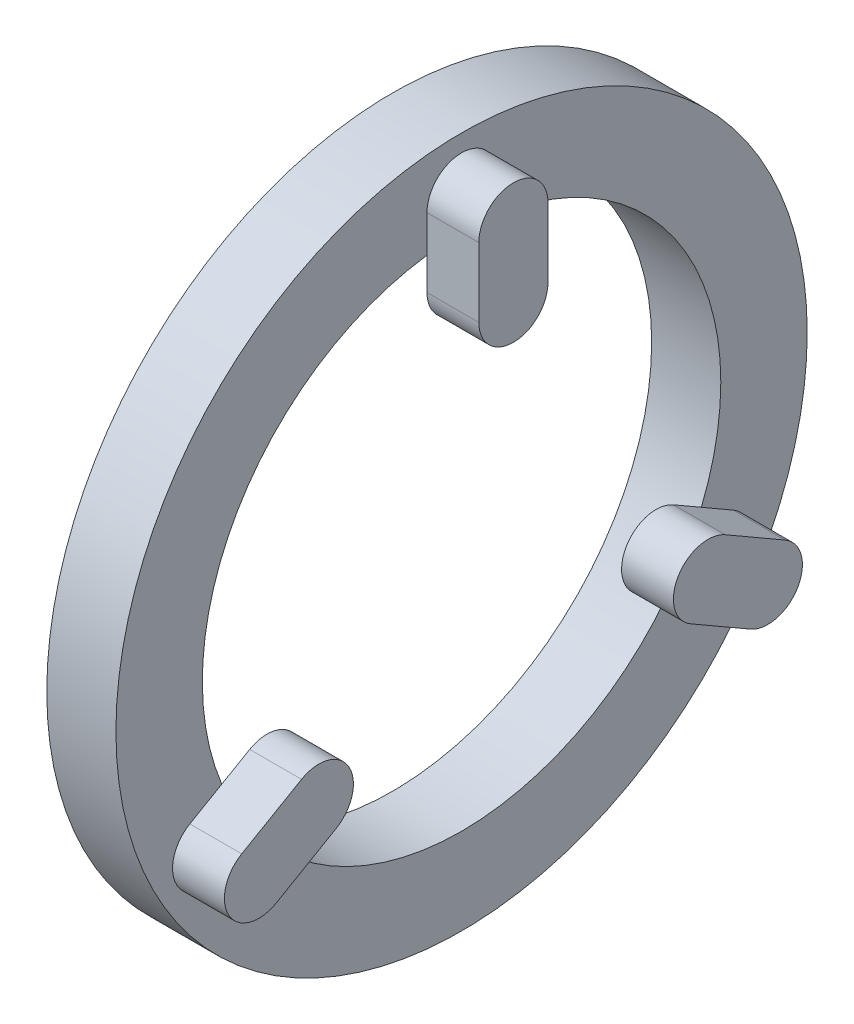
ISO-10303-21;
HEADER;
FILE_DESCRIPTION(('STEP AP214'),'2;1');
FILE_NAME('part.step','',(''),(''),'','','');
FILE_SCHEMA(('AUTOMOTIVE_DESIGN { 1 0 10303 214 1 1 1 1 }'));
ENDSEC;
DATA;
#1=APPLICATION_CONTEXT('core data for automotive mechanical design processes');
#2=APPLICATION_PROTOCOL_DEFINITION('international standard','automotive_design',2000,#1);
#3=PRODUCT_CONTEXT('',#1,'mechanical');
#4=PRODUCT('Part','Part','',(#3));
#5=PRODUCT_RELATED_PRODUCT_CATEGORY('part','',(#4));
#6=PRODUCT_DEFINITION_FORMATION('','',#4);
#7=PRODUCT_DEFINITION_CONTEXT('part definition',#1,'design');
#8=PRODUCT_DEFINITION('design','',#6,#7);
#9=PRODUCT_DEFINITION_SHAPE('','',#8);
#10=(LENGTH_UNIT() NAMED_UNIT(*) SI_UNIT(.MILLI.,.METRE.));
#11=(NAMED_UNIT(*) PLANE_ANGLE_UNIT() SI_UNIT($,.RADIAN.));
#12=(NAMED_UNIT(*) SI_UNIT($,.STERADIAN.) SOLID_ANGLE_UNIT());
#13=UNCERTAINTY_MEASURE_WITH_UNIT(LENGTH_MEASURE(1.E-05),#10,'distance_accuracy_value','');
#14=(GEOMETRIC_REPRESENTATION_CONTEXT(3) GLOBAL_UNCERTAINTY_ASSIGNED_CONTEXT((#13)) GLOBAL_UNIT_ASSIGNED_CONTEXT((#10,
#11,#12)) REPRESENTATION_CONTEXT('',''));
#15=CARTESIAN_POINT('',(0.,0.,0.));
#16=DIRECTION('',(0.,0.,1.));
#17=DIRECTION('',(1.,0.,0.));
#18=AXIS2_PLACEMENT_3D('',#15,#16,#17);
#19=CARTESIAN_POINT('',(2.,0.,0.));
#20=DIRECTION('',(1.,0.,0.));
#21=DIRECTION('',(0.,0.,-1.));
#22=AXIS2_PLACEMENT_3D('',#19,#20,#21);
#23=PLANE('',#22);
#24=DIRECTION('',(0.,0.5,-0.866025403784439));
#25=VECTOR('',#24,1.);
#26=CARTESIAN_POINT('',(2.,-3.38397459621559,7.86121593216771));
#27=LINE('',#26,#25);
#28=CARTESIAN_POINT('',(2.,-3.3839745962156,7.86121593216771));
#29=VERTEX_POINT('',#28);
#30=CARTESIAN_POINT('',(2.,-2.85049178304522,6.93719659479185));
#31=VERTEX_POINT('',#30);
#32=EDGE_CURVE('E314',#29,#31,#27,.T.);
#33=ORIENTED_EDGE('',*,*,#32,.T.);
#34=CARTESIAN_POINT('',(2.,0.,0.));
#35=DIRECTION('',(1.,0.,0.));
#36=DIRECTION('',(0.,0.,-1.));
#37=AXIS2_PLACEMENT_3D('',#34,#35,#36);
#38=CIRCLE('',#37,7.5);
#39=CARTESIAN_POINT('',(2.,7.43303437365925,1.));
#40=VERTEX_POINT('',#39);
#41=EDGE_CURVE('E362',#40,#31,#38,.T.);
#42=ORIENTED_EDGE('',*,*,#41,.F.);
#43=DIRECTION('',(0.,-1.,0.));
#44=VECTOR('',#43,1.);
#45=CARTESIAN_POINT('',(2.,8.5,1.));
#46=LINE('',#45,#44);
#47=CARTESIAN_POINT('',(2.,8.5,1.));
#48=VERTEX_POINT('',#47);
#49=EDGE_CURVE('E355',#48,#40,#46,.T.);
#50=ORIENTED_EDGE('',*,*,#49,.F.);
#51=CARTESIAN_POINT('',(2.,8.5,0.));
#52=DIRECTION('',(1.,0.,0.));
#53=DIRECTION('',(0.,0.,-1.));
#54=AXIS2_PLACEMENT_3D('',#51,#52,#53);
#55=CIRCLE('',#54,1.);
#56=CARTESIAN_POINT('',(2.,8.5,-1.));
#57=VERTEX_POINT('',#56);
#58=EDGE_CURVE('E330',#57,#48,#55,.T.);
#59=ORIENTED_EDGE('',*,*,#58,.F.);
#60=DIRECTION('',(0.,1.,0.));
#61=VECTOR('',#60,1.);
#62=CARTESIAN_POINT('',(2.,6.5,-0.999999999999999));
#63=LINE('',#62,#61);
#64=CARTESIAN_POINT('',(2.,7.43303437365925,-1.));
#65=VERTEX_POINT('',#64);
#66=EDGE_CURVE('E12',#65,#57,#63,.T.);
#67=ORIENTED_EDGE('',*,*,#66,.F.);
#68=CARTESIAN_POINT('',(2.,-2.85049178304517,-6.93719659479188));
#69=VERTEX_POINT('',#68);
#70=EDGE_CURVE('E339',#69,#65,#38,.T.);
#71=ORIENTED_EDGE('',*,*,#70,.F.);
#72=DIRECTION('',(0.,-0.499999999999995,-0.866025403784442));
#73=VECTOR('',#72,1.);
#74=CARTESIAN_POINT('',(2.,-2.38397459621555,-6.12916512459885));
#75=LINE('',#74,#73);
#76=CARTESIAN_POINT('',(2.,-3.38397459621554,-7.86121593216774));
#77=VERTEX_POINT('',#76);
#78=EDGE_CURVE('E318',#69,#77,#75,.T.);
#79=ORIENTED_EDGE('',*,*,#78,.T.);
#80=CARTESIAN_POINT('',(2.,-4.24999999999998,-7.36121593216774));
#81=DIRECTION('',(1.,0.,0.));
#82=DIRECTION('',(0.,0.,-1.));
#83=AXIS2_PLACEMENT_3D('',#80,#81,#82);
#84=CIRCLE('',#83,1.);
#85=CARTESIAN_POINT('',(2.,-5.11602540378442,-6.86121593216774));
#86=VERTEX_POINT('',#85);
#87=EDGE_CURVE('E298',#86,#77,#84,.T.);
#88=ORIENTED_EDGE('',*,*,#87,.F.);
#89=DIRECTION('',(0.,0.500000000000002,0.866025403784437));
#90=VECTOR('',#89,1.);
#91=CARTESIAN_POINT('',(2.,-5.11602540378442,-6.86121593216774));
#92=LINE('',#91,#90);
#93=CARTESIAN_POINT('',(2.,-4.58254259061405,-5.93719659479188));
#94=VERTEX_POINT('',#93);
#95=EDGE_CURVE('E315',#86,#94,#92,.T.);
#96=ORIENTED_EDGE('',*,*,#95,.T.);
#97=CARTESIAN_POINT('',(2.,-4.5825425906141,5.93719659479184));
#98=VERTEX_POINT('',#97);
#99=EDGE_CURVE('E363',#98,#94,#38,.T.);
#100=ORIENTED_EDGE('',*,*,#99,.F.);
#101=DIRECTION('',(0.,-0.500000000000005,0.866025403784436));
#102=VECTOR('',#101,1.);
#103=CARTESIAN_POINT('',(2.,-4.11602540378447,5.12916512459884));
#104=LINE('',#103,#102);
#105=CARTESIAN_POINT('',(2.,-5.11602540378447,6.8612159321677));
#106=VERTEX_POINT('',#105);
#107=EDGE_CURVE('E643',#98,#106,#104,.T.);
#108=ORIENTED_EDGE('',*,*,#107,.T.);
#109=CARTESIAN_POINT('',(2.,-4.25000000000004,7.36121593216771));
#110=DIRECTION('',(1.,0.,0.));
#111=DIRECTION('',(0.,0.,-1.));
#112=AXIS2_PLACEMENT_3D('',#109,#110,#111);
#113=CIRCLE('',#112,1.);
#114=EDGE_CURVE('E265',#29,#106,#113,.T.);
#115=ORIENTED_EDGE('',*,*,#114,.F.);
#116=EDGE_LOOP('',(#33,#42,#50,#59,#67,#71,#79,#88,#96,#100,#108,#115));
#117=FACE_BOUND('',#116,.T.);
#118=CARTESIAN_POINT('',(2.,0.,0.));
#119=DIRECTION('',(1.,0.,0.));
#120=DIRECTION('',(0.,0.,-1.));
#121=AXIS2_PLACEMENT_3D('',#118,#119,#120);
#122=CIRCLE('',#121,10.);
#123=CARTESIAN_POINT('',(2.,0.,-10.));
#124=VERTEX_POINT('',#123);
#125=EDGE_CURVE('E153',#124,#124,#122,.T.);
#126=ORIENTED_EDGE('',*,*,#125,.T.);
#127=EDGE_LOOP('',(#126));
#128=FACE_BOUND('',#127,.T.);
#129=ADVANCED_FACE('F144',(#117,#128),#23,.T.);
#130=CARTESIAN_POINT('',(2.,0.,0.));
#131=DIRECTION('',(-1.,0.,0.));
#132=DIRECTION('',(0.,0.,1.));
#133=AXIS2_PLACEMENT_3D('',#130,#131,#132);
#134=CYLINDRICAL_SURFACE('',#133,10.);
#135=ORIENTED_EDGE('',*,*,#125,.F.);
#136=EDGE_LOOP('',(#135));
#137=FACE_BOUND('',#136,.T.);
#138=CARTESIAN_POINT('',(0.,0.,0.));
#139=DIRECTION('',(1.,0.,0.));
#140=DIRECTION('',(0.,0.,-1.));
#141=AXIS2_PLACEMENT_3D('',#138,#139,#140);
#142=CIRCLE('',#141,10.);
#143=CARTESIAN_POINT('',(0.,0.,-10.));
#144=VERTEX_POINT('',#143);
#145=EDGE_CURVE('E365',#144,#144,#142,.T.);
#146=ORIENTED_EDGE('',*,*,#145,.T.);
#147=EDGE_LOOP('',(#146));
#148=FACE_BOUND('',#147,.T.);
#149=ADVANCED_FACE('F146',(#137,#148),#134,.T.);
#150=CARTESIAN_POINT('',(0.,0.,0.));
#151=DIRECTION('',(1.,0.,0.));
#152=DIRECTION('',(0.,0.,-1.));
#153=AXIS2_PLACEMENT_3D('',#150,#151,#152);
#154=PLANE('',#153);
#155=CARTESIAN_POINT('',(0.,0.,0.));
#156=DIRECTION('',(1.,0.,0.));
#157=DIRECTION('',(0.,0.,-1.));
#158=AXIS2_PLACEMENT_3D('',#155,#156,#157);
#159=CIRCLE('',#158,7.5);
#160=CARTESIAN_POINT('',(0.,0.,-7.5));
#161=VERTEX_POINT('',#160);
#162=EDGE_CURVE('E148',#161,#161,#159,.T.);
#163=ORIENTED_EDGE('',*,*,#162,.T.);
#164=EDGE_LOOP('',(#163));
#165=FACE_BOUND('',#164,.T.);
#166=ORIENTED_EDGE('',*,*,#145,.F.);
#167=EDGE_LOOP('',(#166));
#168=FACE_BOUND('',#167,.T.);
#169=ADVANCED_FACE('F372',(#165,#168),#154,.F.);
#170=CARTESIAN_POINT('',(-10.5,0.,0.));
#171=DIRECTION('',(1.,0.,0.));
#172=DIRECTION('',(0.,0.,-1.));
#173=AXIS2_PLACEMENT_3D('',#170,#171,#172);
#174=CYLINDRICAL_SURFACE('',#173,7.5);
#175=EDGE_CURVE('E359',#65,#40,#38,.T.);
#176=ORIENTED_EDGE('',*,*,#175,.T.);
#177=ORIENTED_EDGE('',*,*,#41,.T.);
#178=EDGE_CURVE('E412',#31,#98,#38,.T.);
#179=ORIENTED_EDGE('',*,*,#178,.T.);
#180=ORIENTED_EDGE('',*,*,#99,.T.);
#181=EDGE_CURVE('E415',#94,#69,#38,.T.);
#182=ORIENTED_EDGE('',*,*,#181,.T.);
#183=ORIENTED_EDGE('',*,*,#70,.T.);
#184=EDGE_LOOP('',(#176,#177,#179,#180,#182,#183));
#185=FACE_BOUND('',#184,.T.);
#186=ORIENTED_EDGE('',*,*,#162,.F.);
#187=EDGE_LOOP('',(#186));
#188=FACE_BOUND('',#187,.T.);
#189=ADVANCED_FACE('F375',(#185,#188),#174,.F.);
#190=CARTESIAN_POINT('',(2.,8.5,0.));
#191=DIRECTION('',(1.,0.,0.));
#192=DIRECTION('',(0.,0.,-1.));
#193=AXIS2_PLACEMENT_3D('',#190,#191,#192);
#194=PLANE('',#193);
#195=ORIENTED_EDGE('',*,*,#175,.F.);
#196=CARTESIAN_POINT('',(2.,6.5,-0.999999999999999));
#197=VERTEX_POINT('',#196);
#198=EDGE_CURVE('E155',#197,#65,#63,.T.);
#199=ORIENTED_EDGE('',*,*,#198,.F.);
#200=CARTESIAN_POINT('',(2.,6.5,0.));
#201=DIRECTION('',(1.,0.,0.));
#202=DIRECTION('',(0.,0.,-1.));
#203=AXIS2_PLACEMENT_3D('',#200,#201,#202);
#204=CIRCLE('',#203,0.999999999999999);
#205=CARTESIAN_POINT('',(2.,6.5,0.999999999999999));
#206=VERTEX_POINT('',#205);
#207=EDGE_CURVE('E344',#206,#197,#204,.T.);
#208=ORIENTED_EDGE('',*,*,#207,.F.);
#209=EDGE_CURVE('E294',#40,#206,#46,.T.);
#210=ORIENTED_EDGE('',*,*,#209,.F.);
#211=EDGE_LOOP('',(#195,#199,#208,#210));
#212=FACE_BOUND('',#211,.T.);
#213=ADVANCED_FACE('F377',(#212),#194,.F.);
#214=CARTESIAN_POINT('',(3.5,8.5,0.));
#215=DIRECTION('',(1.,0.,0.));
#216=DIRECTION('',(0.,0.,-1.));
#217=AXIS2_PLACEMENT_3D('',#214,#215,#216);
#218=PLANE('',#217);
#219=DIRECTION('',(0.,-1.,0.));
#220=VECTOR('',#219,1.);
#221=CARTESIAN_POINT('',(3.5,8.5,1.));
#222=LINE('',#221,#220);
#223=CARTESIAN_POINT('',(3.5,8.5,1.));
#224=VERTEX_POINT('',#223);
#225=CARTESIAN_POINT('',(3.5,6.5,0.999999999999999));
#226=VERTEX_POINT('',#225);
#227=EDGE_CURVE('E350',#224,#226,#222,.T.);
#228=ORIENTED_EDGE('',*,*,#227,.T.);
#229=CARTESIAN_POINT('',(3.5,6.5,0.));
#230=DIRECTION('',(1.,0.,0.));
#231=DIRECTION('',(0.,0.,-1.));
#232=AXIS2_PLACEMENT_3D('',#229,#230,#231);
#233=CIRCLE('',#232,0.999999999999999);
#234=CARTESIAN_POINT('',(3.5,6.5,-0.999999999999999));
#235=VERTEX_POINT('',#234);
#236=EDGE_CURVE('E340',#226,#235,#233,.T.);
#237=ORIENTED_EDGE('',*,*,#236,.T.);
#238=DIRECTION('',(0.,1.,0.));
#239=VECTOR('',#238,1.);
#240=CARTESIAN_POINT('',(3.5,6.5,-0.999999999999999));
#241=LINE('',#240,#239);
#242=CARTESIAN_POINT('',(3.5,8.5,-1.));
#243=VERTEX_POINT('',#242);
#244=EDGE_CURVE('E347',#235,#243,#241,.T.);
#245=ORIENTED_EDGE('',*,*,#244,.T.);
#246=CARTESIAN_POINT('',(3.5,8.5,0.));
#247=DIRECTION('',(1.,0.,0.));
#248=DIRECTION('',(0.,0.,-1.));
#249=AXIS2_PLACEMENT_3D('',#246,#247,#248);
#250=CIRCLE('',#249,1.);
#251=EDGE_CURVE('E326',#243,#224,#250,.T.);
#252=ORIENTED_EDGE('',*,*,#251,.T.);
#253=EDGE_LOOP('',(#228,#237,#245,#252));
#254=FACE_BOUND('',#253,.T.);
#255=ADVANCED_FACE('F385',(#254),#218,.T.);
#256=CARTESIAN_POINT('',(3.5,8.5,0.));
#257=DIRECTION('',(-1.,0.,0.));
#258=DIRECTION('',(0.,0.,1.));
#259=AXIS2_PLACEMENT_3D('',#256,#257,#258);
#260=CYLINDRICAL_SURFACE('',#259,1.);
#261=DIRECTION('',(-1.,0.,0.));
#262=VECTOR('',#261,1.);
#263=CARTESIAN_POINT('',(3.5,8.5,1.));
#264=LINE('',#263,#262);
#265=EDGE_CURVE('E336',#224,#48,#264,.T.);
#266=ORIENTED_EDGE('',*,*,#265,.F.);
#267=ORIENTED_EDGE('',*,*,#251,.F.);
#268=DIRECTION('',(-1.,0.,0.));
#269=VECTOR('',#268,1.);
#270=CARTESIAN_POINT('',(3.5,8.5,-1.));
#271=LINE('',#270,#269);
#272=EDGE_CURVE('E329',#243,#57,#271,.T.);
#273=ORIENTED_EDGE('',*,*,#272,.T.);
#274=ORIENTED_EDGE('',*,*,#58,.T.);
#275=EDGE_LOOP('',(#266,#267,#273,#274));
#276=FACE_BOUND('',#275,.T.);
#277=ADVANCED_FACE('F380',(#276),#260,.T.);
#278=CARTESIAN_POINT('',(3.5,6.5,0.));
#279=DIRECTION('',(-1.,0.,0.));
#280=DIRECTION('',(0.,0.,1.));
#281=AXIS2_PLACEMENT_3D('',#278,#279,#280);
#282=CYLINDRICAL_SURFACE('',#281,0.999999999999999);
#283=DIRECTION('',(-1.,0.,0.));
#284=VECTOR('',#283,1.);
#285=CARTESIAN_POINT('',(3.5,6.5,0.999999999999999));
#286=LINE('',#285,#284);
#287=EDGE_CURVE('E333',#206,#226,#286,.F.);
#288=ORIENTED_EDGE('',*,*,#287,.F.);
#289=ORIENTED_EDGE('',*,*,#207,.T.);
#290=DIRECTION('',(-1.,0.,0.));
#291=VECTOR('',#290,1.);
#292=CARTESIAN_POINT('',(3.5,6.5,-0.999999999999999));
#293=LINE('',#292,#291);
#294=EDGE_CURVE('E343',#235,#197,#293,.T.);
#295=ORIENTED_EDGE('',*,*,#294,.F.);
#296=ORIENTED_EDGE('',*,*,#236,.F.);
#297=EDGE_LOOP('',(#288,#289,#295,#296));
#298=FACE_BOUND('',#297,.T.);
#299=ADVANCED_FACE('F388',(#298),#282,.T.);
#300=CARTESIAN_POINT('',(3.5,6.5,-0.999999999999999));
#301=DIRECTION('',(0.,0.,1.));
#302=DIRECTION('',(0.,-1.,0.));
#303=AXIS2_PLACEMENT_3D('',#300,#301,#302);
#304=PLANE('',#303);
#305=ORIENTED_EDGE('',*,*,#198,.T.);
#306=ORIENTED_EDGE('',*,*,#66,.T.);
#307=ORIENTED_EDGE('',*,*,#272,.F.);
#308=ORIENTED_EDGE('',*,*,#244,.F.);
#309=ORIENTED_EDGE('',*,*,#294,.T.);
#310=EDGE_LOOP('',(#305,#306,#307,#308,#309));
#311=FACE_BOUND('',#310,.T.);
#312=ADVANCED_FACE('F423',(#311),#304,.F.);
#313=CARTESIAN_POINT('',(3.5,8.5,1.));
#314=DIRECTION('',(0.,0.,-1.));
#315=DIRECTION('',(0.,1.,0.));
#316=AXIS2_PLACEMENT_3D('',#313,#314,#315);
#317=PLANE('',#316);
#318=ORIENTED_EDGE('',*,*,#49,.T.);
#319=ORIENTED_EDGE('',*,*,#209,.T.);
#320=ORIENTED_EDGE('',*,*,#287,.T.);
#321=ORIENTED_EDGE('',*,*,#227,.F.);
#322=ORIENTED_EDGE('',*,*,#265,.T.);
#323=EDGE_LOOP('',(#318,#319,#320,#321,#322));
#324=FACE_BOUND('',#323,.T.);
#325=ADVANCED_FACE('F430',(#324),#317,.F.);
#326=CARTESIAN_POINT('',(2.,0.,0.));
#327=DIRECTION('',(-1.,0.,0.));
#328=DIRECTION('',(0.,0.,1.));
#329=AXIS2_PLACEMENT_3D('',#326,#327,#328);
#330=PLANE('',#329);
#331=ORIENTED_EDGE('',*,*,#181,.F.);
#332=CARTESIAN_POINT('',(2.,-4.11602540378441,-5.12916512459885));
#333=VERTEX_POINT('',#332);
#334=EDGE_CURVE('E319',#94,#333,#92,.T.);
#335=ORIENTED_EDGE('',*,*,#334,.T.);
#336=CARTESIAN_POINT('',(2.,-3.24999999999998,-5.62916512459886));
#337=DIRECTION('',(1.,0.,0.));
#338=DIRECTION('',(0.,0.,-1.));
#339=AXIS2_PLACEMENT_3D('',#336,#337,#338);
#340=CIRCLE('',#339,1.);
#341=CARTESIAN_POINT('',(2.,-2.38397459621555,-6.12916512459885));
#342=VERTEX_POINT('',#341);
#343=EDGE_CURVE('E291',#342,#333,#340,.T.);
#344=ORIENTED_EDGE('',*,*,#343,.F.);
#345=EDGE_CURVE('E170',#342,#69,#75,.T.);
#346=ORIENTED_EDGE('',*,*,#345,.T.);
#347=EDGE_LOOP('',(#331,#335,#344,#346));
#348=FACE_BOUND('',#347,.T.);
#349=ADVANCED_FACE('F435',(#348),#330,.T.);
#350=CARTESIAN_POINT('',(3.5,0.,0.));
#351=DIRECTION('',(-1.,0.,0.));
#352=DIRECTION('',(0.,0.,1.));
#353=AXIS2_PLACEMENT_3D('',#350,#351,#352);
#354=PLANE('',#353);
#355=DIRECTION('',(0.,0.500000000000002,0.866025403784437));
#356=VECTOR('',#355,1.);
#357=CARTESIAN_POINT('',(3.5,-5.11602540378442,-6.86121593216774));
#358=LINE('',#357,#356);
#359=CARTESIAN_POINT('',(3.5,-5.11602540378442,-6.86121593216774));
#360=VERTEX_POINT('',#359);
#361=CARTESIAN_POINT('',(3.5,-4.11602540378441,-5.12916512459885));
#362=VERTEX_POINT('',#361);
#363=EDGE_CURVE('E306',#360,#362,#358,.T.);
#364=ORIENTED_EDGE('',*,*,#363,.F.);
#365=CARTESIAN_POINT('',(3.5,-4.24999999999998,-7.36121593216774));
#366=DIRECTION('',(1.,0.,0.));
#367=DIRECTION('',(0.,0.,-1.));
#368=AXIS2_PLACEMENT_3D('',#365,#366,#367);
#369=CIRCLE('',#368,1.);
#370=CARTESIAN_POINT('',(3.5,-3.38397459621554,-7.86121593216774));
#371=VERTEX_POINT('',#370);
#372=EDGE_CURVE('E301',#360,#371,#369,.T.);
#373=ORIENTED_EDGE('',*,*,#372,.T.);
#374=DIRECTION('',(0.,-0.499999999999995,-0.866025403784442));
#375=VECTOR('',#374,1.);
#376=CARTESIAN_POINT('',(3.5,-2.38397459621555,-6.12916512459885));
#377=LINE('',#376,#375);
#378=CARTESIAN_POINT('',(3.5,-2.38397459621555,-6.12916512459885));
#379=VERTEX_POINT('',#378);
#380=EDGE_CURVE('E323',#379,#371,#377,.T.);
#381=ORIENTED_EDGE('',*,*,#380,.F.);
#382=CARTESIAN_POINT('',(3.5,-3.24999999999998,-5.62916512459886));
#383=DIRECTION('',(1.,0.,0.));
#384=DIRECTION('',(0.,0.,-1.));
#385=AXIS2_PLACEMENT_3D('',#382,#383,#384);
#386=CIRCLE('',#385,1.);
#387=EDGE_CURVE('E295',#379,#362,#386,.T.);
#388=ORIENTED_EDGE('',*,*,#387,.T.);
#389=EDGE_LOOP('',(#364,#373,#381,#388));
#390=FACE_BOUND('',#389,.T.);
#391=ADVANCED_FACE('F440',(#390),#354,.F.);
#392=CARTESIAN_POINT('',(3.5,-2.38397459621555,-6.12916512459885));
#393=DIRECTION('',(0.,0.866025403784441,-0.499999999999995));
#394=DIRECTION('',(0.,0.499999999999995,0.866025403784442));
#395=AXIS2_PLACEMENT_3D('',#392,#393,#394);
#396=PLANE('',#395);
#397=ORIENTED_EDGE('',*,*,#345,.F.);
#398=DIRECTION('',(-1.,0.,0.));
#399=VECTOR('',#398,1.);
#400=CARTESIAN_POINT('',(3.5,-2.38397459621555,-6.12916512459885));
#401=LINE('',#400,#399);
#402=EDGE_CURVE('E304',#379,#342,#401,.T.);
#403=ORIENTED_EDGE('',*,*,#402,.F.);
#404=ORIENTED_EDGE('',*,*,#380,.T.);
#405=DIRECTION('',(-1.,0.,0.));
#406=VECTOR('',#405,1.);
#407=CARTESIAN_POINT('',(3.5,-3.38397459621554,-7.86121593216774));
#408=LINE('',#407,#406);
#409=EDGE_CURVE('E307',#371,#77,#408,.T.);
#410=ORIENTED_EDGE('',*,*,#409,.T.);
#411=ORIENTED_EDGE('',*,*,#78,.F.);
#412=EDGE_LOOP('',(#397,#403,#404,#410,#411));
#413=FACE_BOUND('',#412,.T.);
#414=ADVANCED_FACE('F530',(#413),#396,.T.);
#415=CARTESIAN_POINT('',(3.5,-5.11602540378442,-6.86121593216774));
#416=DIRECTION('',(0.,-0.866025403784437,0.500000000000002));
#417=DIRECTION('',(0.,-0.500000000000002,-0.866025403784437));
#418=AXIS2_PLACEMENT_3D('',#415,#416,#417);
#419=PLANE('',#418);
#420=ORIENTED_EDGE('',*,*,#95,.F.);
#421=DIRECTION('',(-1.,0.,0.));
#422=VECTOR('',#421,1.);
#423=CARTESIAN_POINT('',(3.5,-5.11602540378442,-6.86121593216774));
#424=LINE('',#423,#422);
#425=EDGE_CURVE('E309',#360,#86,#424,.T.);
#426=ORIENTED_EDGE('',*,*,#425,.F.);
#427=ORIENTED_EDGE('',*,*,#363,.T.);
#428=DIRECTION('',(-1.,0.,0.));
#429=VECTOR('',#428,1.);
#430=CARTESIAN_POINT('',(3.5,-4.11602540378441,-5.12916512459885));
#431=LINE('',#430,#429);
#432=EDGE_CURVE('E311',#362,#333,#431,.T.);
#433=ORIENTED_EDGE('',*,*,#432,.T.);
#434=ORIENTED_EDGE('',*,*,#334,.F.);
#435=EDGE_LOOP('',(#420,#426,#427,#433,#434));
#436=FACE_BOUND('',#435,.T.);
#437=ADVANCED_FACE('F442',(#436),#419,.T.);
#438=CARTESIAN_POINT('',(3.5,-3.24999999999998,-5.62916512459886));
#439=DIRECTION('',(-1.,0.,0.));
#440=DIRECTION('',(0.,0.,1.));
#441=AXIS2_PLACEMENT_3D('',#438,#439,#440);
#442=CYLINDRICAL_SURFACE('',#441,1.);
#443=ORIENTED_EDGE('',*,*,#343,.T.);
#444=ORIENTED_EDGE('',*,*,#432,.F.);
#445=ORIENTED_EDGE('',*,*,#387,.F.);
#446=ORIENTED_EDGE('',*,*,#402,.T.);
#447=EDGE_LOOP('',(#443,#444,#445,#446));
#448=FACE_BOUND('',#447,.T.);
#449=ADVANCED_FACE('F548',(#448),#442,.T.);
#450=CARTESIAN_POINT('',(3.5,-4.24999999999998,-7.36121593216774));
#451=DIRECTION('',(-1.,0.,0.));
#452=DIRECTION('',(0.,0.,1.));
#453=AXIS2_PLACEMENT_3D('',#450,#451,#452);
#454=CYLINDRICAL_SURFACE('',#453,1.);
#455=ORIENTED_EDGE('',*,*,#425,.T.);
#456=ORIENTED_EDGE('',*,*,#87,.T.);
#457=ORIENTED_EDGE('',*,*,#409,.F.);
#458=ORIENTED_EDGE('',*,*,#372,.F.);
#459=EDGE_LOOP('',(#455,#456,#457,#458));
#460=FACE_BOUND('',#459,.T.);
#461=ADVANCED_FACE('F533',(#460),#454,.T.);
#462=CARTESIAN_POINT('',(2.,-4.25000000000004,7.36121593216771));
#463=DIRECTION('',(1.,0.,0.));
#464=DIRECTION('',(0.,0.,-1.));
#465=AXIS2_PLACEMENT_3D('',#462,#463,#464);
#466=PLANE('',#465);
#467=CARTESIAN_POINT('',(2.,-4.11602540378447,5.12916512459883));
#468=VERTEX_POINT('',#467);
#469=EDGE_CURVE('E162',#468,#98,#104,.T.);
#470=ORIENTED_EDGE('',*,*,#469,.T.);
#471=ORIENTED_EDGE('',*,*,#178,.F.);
#472=CARTESIAN_POINT('',(2.,-2.38397459621559,6.12916512459884));
#473=VERTEX_POINT('',#472);
#474=EDGE_CURVE('E409',#31,#473,#27,.T.);
#475=ORIENTED_EDGE('',*,*,#474,.T.);
#476=CARTESIAN_POINT('',(2.,-3.25000000000003,5.62916512459884));
#477=DIRECTION('',(1.,0.,0.));
#478=DIRECTION('',(0.,0.,-1.));
#479=AXIS2_PLACEMENT_3D('',#476,#477,#478);
#480=CIRCLE('',#479,1.);
#481=EDGE_CURVE('E275',#468,#473,#480,.T.);
#482=ORIENTED_EDGE('',*,*,#481,.F.);
#483=EDGE_LOOP('',(#470,#471,#475,#482));
#484=FACE_BOUND('',#483,.T.);
#485=ADVANCED_FACE('F532',(#484),#466,.F.);
#486=CARTESIAN_POINT('',(3.5,-4.25000000000004,7.36121593216771));
#487=DIRECTION('',(1.,0.,0.));
#488=DIRECTION('',(0.,0.,-1.));
#489=AXIS2_PLACEMENT_3D('',#486,#487,#488);
#490=PLANE('',#489);
#491=DIRECTION('',(0.,0.5,-0.866025403784439));
#492=VECTOR('',#491,1.);
#493=CARTESIAN_POINT('',(3.5,-3.38397459621559,7.86121593216771));
#494=LINE('',#493,#492);
#495=CARTESIAN_POINT('',(3.5,-3.3839745962156,7.86121593216771));
#496=VERTEX_POINT('',#495);
#497=CARTESIAN_POINT('',(3.5,-2.3839745962156,6.12916512459883));
#498=VERTEX_POINT('',#497);
#499=EDGE_CURVE('E274',#496,#498,#494,.T.);
#500=ORIENTED_EDGE('',*,*,#499,.F.);
#501=CARTESIAN_POINT('',(3.5,-4.25000000000004,7.36121593216771));
#502=DIRECTION('',(1.,0.,0.));
#503=DIRECTION('',(0.,0.,-1.));
#504=AXIS2_PLACEMENT_3D('',#501,#502,#503);
#505=CIRCLE('',#504,1.);
#506=CARTESIAN_POINT('',(3.5,-5.11602540378447,6.8612159321677));
#507=VERTEX_POINT('',#506);
#508=EDGE_CURVE('E273',#496,#507,#505,.T.);
#509=ORIENTED_EDGE('',*,*,#508,.T.);
#510=DIRECTION('',(0.,-0.500000000000005,0.866025403784436));
#511=VECTOR('',#510,1.);
#512=CARTESIAN_POINT('',(3.5,-4.11602540378447,5.12916512459884));
#513=LINE('',#512,#511);
#514=CARTESIAN_POINT('',(3.5,-4.11602540378447,5.12916512459884));
#515=VERTEX_POINT('',#514);
#516=EDGE_CURVE('E259',#515,#507,#513,.T.);
#517=ORIENTED_EDGE('',*,*,#516,.F.);
#518=CARTESIAN_POINT('',(3.5,-3.25000000000003,5.62916512459884));
#519=DIRECTION('',(1.,0.,0.));
#520=DIRECTION('',(0.,0.,-1.));
#521=AXIS2_PLACEMENT_3D('',#518,#519,#520);
#522=CIRCLE('',#521,1.);
#523=EDGE_CURVE('E271',#515,#498,#522,.T.);
#524=ORIENTED_EDGE('',*,*,#523,.T.);
#525=EDGE_LOOP('',(#500,#509,#517,#524));
#526=FACE_BOUND('',#525,.T.);
#527=ADVANCED_FACE('F270',(#526),#490,.T.);
#528=CARTESIAN_POINT('',(3.5,-4.25000000000004,7.36121593216771));
#529=DIRECTION('',(-1.,0.,0.));
#530=DIRECTION('',(0.,0.,1.));
#531=AXIS2_PLACEMENT_3D('',#528,#529,#530);
#532=CYLINDRICAL_SURFACE('',#531,1.);
#533=DIRECTION('',(-1.,0.,0.));
#534=VECTOR('',#533,1.);
#535=CARTESIAN_POINT('',(3.5,-5.11602540378447,6.8612159321677));
#536=LINE('',#535,#534);
#537=EDGE_CURVE('E284',#507,#106,#536,.T.);
#538=ORIENTED_EDGE('',*,*,#537,.F.);
#539=ORIENTED_EDGE('',*,*,#508,.F.);
#540=DIRECTION('',(-1.,0.,0.));
#541=VECTOR('',#540,1.);
#542=CARTESIAN_POINT('',(3.5,-3.3839745962156,7.86121593216771));
#543=LINE('',#542,#541);
#544=EDGE_CURVE('E286',#496,#29,#543,.T.);
#545=ORIENTED_EDGE('',*,*,#544,.T.);
#546=ORIENTED_EDGE('',*,*,#114,.T.);
#547=EDGE_LOOP('',(#538,#539,#545,#546));
#548=FACE_BOUND('',#547,.T.);
#549=ADVANCED_FACE('F580',(#548),#532,.T.);
#550=CARTESIAN_POINT('',(3.5,-3.25000000000003,5.62916512459884));
#551=DIRECTION('',(-1.,0.,0.));
#552=DIRECTION('',(0.,0.,1.));
#553=AXIS2_PLACEMENT_3D('',#550,#551,#552);
#554=CYLINDRICAL_SURFACE('',#553,1.);
#555=ORIENTED_EDGE('',*,*,#523,.F.);
#556=DIRECTION('',(-1.,0.,0.));
#557=VECTOR('',#556,1.);
#558=CARTESIAN_POINT('',(3.5,-4.11602540378447,5.12916512459884));
#559=LINE('',#558,#557);
#560=EDGE_CURVE('E256',#515,#468,#559,.T.);
#561=ORIENTED_EDGE('',*,*,#560,.T.);
#562=ORIENTED_EDGE('',*,*,#481,.T.);
#563=DIRECTION('',(-1.,0.,0.));
#564=VECTOR('',#563,1.);
#565=CARTESIAN_POINT('',(3.5,-2.38397459621559,6.12916512459884));
#566=LINE('',#565,#564);
#567=EDGE_CURVE('E264',#498,#473,#566,.T.);
#568=ORIENTED_EDGE('',*,*,#567,.F.);
#569=EDGE_LOOP('',(#555,#561,#562,#568));
#570=FACE_BOUND('',#569,.T.);
#571=ADVANCED_FACE('F277',(#570),#554,.T.);
#572=CARTESIAN_POINT('',(3.5,-3.38397459621559,7.86121593216771));
#573=DIRECTION('',(0.,0.866025403784439,0.5));
#574=DIRECTION('',(0.,-0.5,0.866025403784439));
#575=AXIS2_PLACEMENT_3D('',#572,#573,#574);
#576=PLANE('',#575);
#577=ORIENTED_EDGE('',*,*,#32,.F.);
#578=ORIENTED_EDGE('',*,*,#544,.F.);
#579=ORIENTED_EDGE('',*,*,#499,.T.);
#580=ORIENTED_EDGE('',*,*,#567,.T.);
#581=ORIENTED_EDGE('',*,*,#474,.F.);
#582=EDGE_LOOP('',(#577,#578,#579,#580,#581));
#583=FACE_BOUND('',#582,.T.);
#584=ADVANCED_FACE('F594',(#583),#576,.T.);
#585=CARTESIAN_POINT('',(3.5,-4.11602540378447,5.12916512459884));
#586=DIRECTION('',(0.,-0.866025403784436,-0.500000000000005));
#587=DIRECTION('',(0.,0.500000000000005,-0.866025403784436));
#588=AXIS2_PLACEMENT_3D('',#585,#586,#587);
#589=PLANE('',#588);
#590=ORIENTED_EDGE('',*,*,#469,.F.);
#591=ORIENTED_EDGE('',*,*,#560,.F.);
#592=ORIENTED_EDGE('',*,*,#516,.T.);
#593=ORIENTED_EDGE('',*,*,#537,.T.);
#594=ORIENTED_EDGE('',*,*,#107,.F.);
#595=EDGE_LOOP('',(#590,#591,#592,#593,#594));
#596=FACE_BOUND('',#595,.T.);
#597=ADVANCED_FACE('F258',(#596),#589,.T.);
#598=CLOSED_SHELL('',(#129,#149,#169,#189,#213,#255,#277,#299,#312,#325,#349,#391,#414,#437,
#449,#461,#485,#527,#549,#571,#584,#597));
#599=MANIFOLD_SOLID_BREP('B2',#598);
#600=ADVANCED_BREP_SHAPE_REPRESENTATION('',(#18,#599),#14);
#601=SHAPE_DEFINITION_REPRESENTATION(#9,#600);
ENDSEC;
END-ISO-10303-21;
